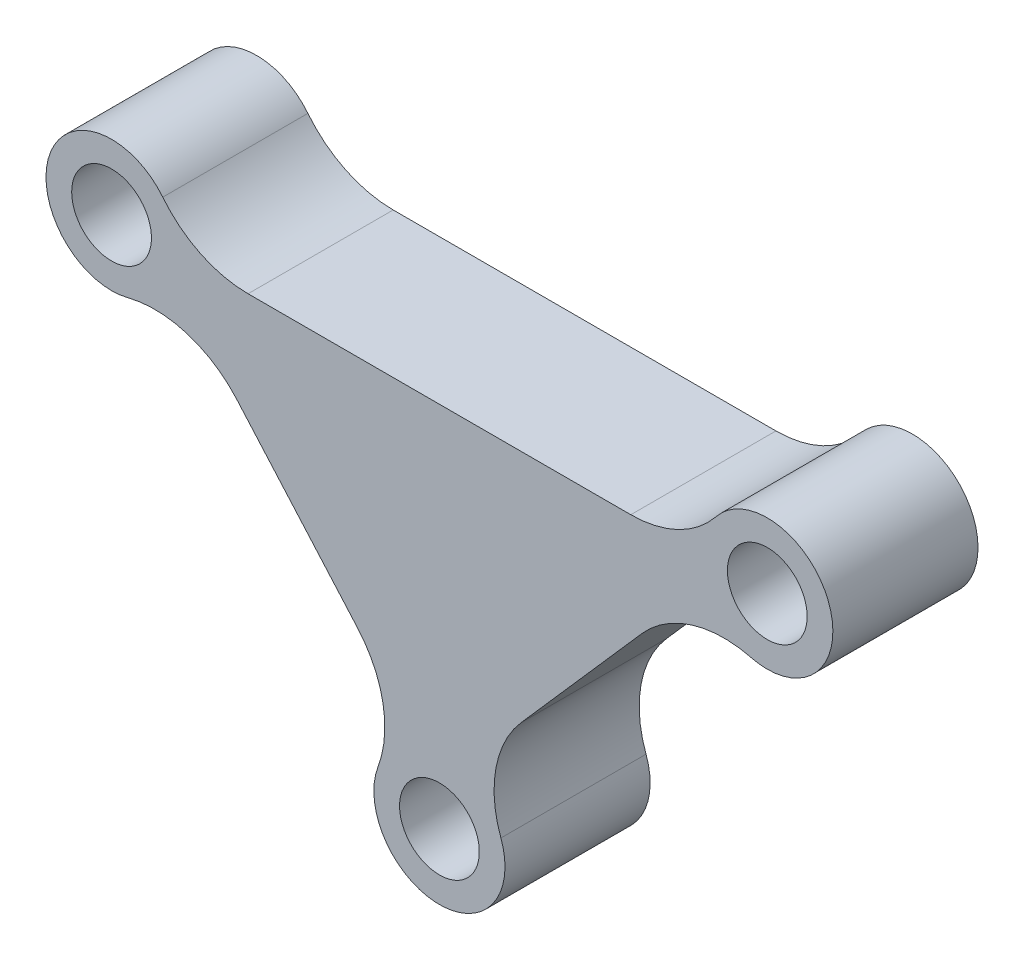
ISO-10303-21;
HEADER;
FILE_DESCRIPTION(('STEP AP214'),'2;1');
FILE_NAME('part.step','',(''),(''),'','','');
FILE_SCHEMA(('AUTOMOTIVE_DESIGN { 1 0 10303 214 1 1 1 1 }'));
ENDSEC;
DATA;
#1=APPLICATION_CONTEXT('core data for automotive mechanical design processes');
#2=APPLICATION_PROTOCOL_DEFINITION('international standard','automotive_design',2000,#1);
#3=PRODUCT_CONTEXT('',#1,'mechanical');
#4=PRODUCT('Part','Part','',(#3));
#5=PRODUCT_RELATED_PRODUCT_CATEGORY('part','',(#4));
#6=PRODUCT_DEFINITION_FORMATION('','',#4);
#7=PRODUCT_DEFINITION_CONTEXT('part definition',#1,'design');
#8=PRODUCT_DEFINITION('design','',#6,#7);
#9=PRODUCT_DEFINITION_SHAPE('','',#8);
#10=(LENGTH_UNIT() NAMED_UNIT(*) SI_UNIT(.MILLI.,.METRE.));
#11=(NAMED_UNIT(*) PLANE_ANGLE_UNIT() SI_UNIT($,.RADIAN.));
#12=(NAMED_UNIT(*) SI_UNIT($,.STERADIAN.) SOLID_ANGLE_UNIT());
#13=UNCERTAINTY_MEASURE_WITH_UNIT(LENGTH_MEASURE(1.E-05),#10,'distance_accuracy_value','');
#14=(GEOMETRIC_REPRESENTATION_CONTEXT(3) GLOBAL_UNCERTAINTY_ASSIGNED_CONTEXT((#13)) GLOBAL_UNIT_ASSIGNED_CONTEXT((#10,
#11,#12)) REPRESENTATION_CONTEXT('',''));
#15=CARTESIAN_POINT('',(0.,0.,0.));
#16=DIRECTION('',(0.,0.,1.));
#17=DIRECTION('',(1.,0.,0.));
#18=AXIS2_PLACEMENT_3D('',#15,#16,#17);
#19=CARTESIAN_POINT('',(0.,0.,6.64));
#20=DIRECTION('',(0.,0.,1.));
#21=DIRECTION('',(1.,0.,0.));
#22=AXIS2_PLACEMENT_3D('',#19,#20,#21);
#23=PLANE('',#22);
#24=CARTESIAN_POINT('',(-15.,10.,6.64));
#25=DIRECTION('',(0.,0.,1.));
#26=DIRECTION('',(1.,0.,0.));
#27=AXIS2_PLACEMENT_3D('',#24,#25,#26);
#28=CIRCLE('',#27,1.825);
#29=CARTESIAN_POINT('',(-16.825,10.,6.64));
#30=VERTEX_POINT('',#29);
#31=EDGE_CURVE('E429',#30,#30,#28,.T.);
#32=ORIENTED_EDGE('',*,*,#31,.F.);
#33=EDGE_LOOP('',(#32));
#34=FACE_BOUND('',#33,.T.);
#35=CARTESIAN_POINT('',(15.,10.,6.64));
#36=DIRECTION('',(0.,0.,1.));
#37=DIRECTION('',(1.,0.,0.));
#38=AXIS2_PLACEMENT_3D('',#35,#36,#37);
#39=CIRCLE('',#38,1.825);
#40=CARTESIAN_POINT('',(13.175,10.,6.64));
#41=VERTEX_POINT('',#40);
#42=EDGE_CURVE('E419',#41,#41,#39,.T.);
#43=ORIENTED_EDGE('',*,*,#42,.F.);
#44=EDGE_LOOP('',(#43));
#45=FACE_BOUND('',#44,.T.);
#46=CARTESIAN_POINT('',(0.,-6.825,6.64));
#47=DIRECTION('',(0.,0.,1.));
#48=DIRECTION('',(1.,0.,0.));
#49=AXIS2_PLACEMENT_3D('',#46,#47,#48);
#50=CIRCLE('',#49,1.825);
#51=CARTESIAN_POINT('',(-1.825,-6.825,6.64));
#52=VERTEX_POINT('',#51);
#53=EDGE_CURVE('E418',#52,#52,#50,.T.);
#54=ORIENTED_EDGE('',*,*,#53,.F.);
#55=EDGE_LOOP('',(#54));
#56=FACE_BOUND('',#55,.T.);
#57=DIRECTION('',(-0.659921886299402,0.751334215900647,0.));
#58=VECTOR('',#57,1.);
#59=CARTESIAN_POINT('',(-2.47910946499218,-2.1774844800848,6.64));
#60=LINE('',#59,#58);
#61=CARTESIAN_POINT('',(-3.74245116446397,-0.7391447842915,6.64));
#62=VERTEX_POINT('',#61);
#63=CARTESIAN_POINT('',(-9.26477937711987,5.54813591322946,6.64));
#64=VERTEX_POINT('',#63);
#65=EDGE_CURVE('E404',#62,#64,#60,.T.);
#66=ORIENTED_EDGE('',*,*,#65,.F.);
#67=CARTESIAN_POINT('',(-7.4991222439672,-4.03875421578851,6.64));
#68=DIRECTION('',(0.,0.,1.));
#69=DIRECTION('',(1.,0.,0.));
#70=AXIS2_PLACEMENT_3D('',#67,#68,#69);
#71=CIRCLE('',#70,5.);
#72=CARTESIAN_POINT('',(-2.8121708414877,-5.78015783092069,6.64));
#73=VERTEX_POINT('',#72);
#74=EDGE_CURVE('E372',#62,#73,#71,.F.);
#75=ORIENTED_EDGE('',*,*,#74,.T.);
#76=CARTESIAN_POINT('',(0.,-6.825,6.64));
#77=DIRECTION('',(0.,0.,1.));
#78=DIRECTION('',(1.,0.,0.));
#79=AXIS2_PLACEMENT_3D('',#76,#77,#78);
#80=CIRCLE('',#79,3.);
#81=CARTESIAN_POINT('',(2.8121708414877,-5.78015783092069,6.64));
#82=VERTEX_POINT('',#81);
#83=EDGE_CURVE('E401',#73,#82,#80,.T.);
#84=ORIENTED_EDGE('',*,*,#83,.T.);
#85=CARTESIAN_POINT('',(7.4991222439672,-4.03875421578851,6.64));
#86=DIRECTION('',(0.,0.,1.));
#87=DIRECTION('',(1.,0.,0.));
#88=AXIS2_PLACEMENT_3D('',#85,#86,#87);
#89=CIRCLE('',#88,5.);
#90=CARTESIAN_POINT('',(3.74245116446397,-0.739144784291498,6.64));
#91=VERTEX_POINT('',#90);
#92=EDGE_CURVE('E12',#82,#91,#89,.F.);
#93=ORIENTED_EDGE('',*,*,#92,.T.);
#94=DIRECTION('',(-0.659921886299402,-0.751334215900647,0.));
#95=VECTOR('',#94,1.);
#96=CARTESIAN_POINT('',(2.47910946499218,-2.1774844800848,6.64));
#97=LINE('',#96,#95);
#98=CARTESIAN_POINT('',(9.26477937711987,5.54813591322946,6.64));
#99=VERTEX_POINT('',#98);
#100=EDGE_CURVE('E399',#99,#91,#97,.T.);
#101=ORIENTED_EDGE('',*,*,#100,.F.);
#102=CARTESIAN_POINT('',(13.0214504566231,2.24852648173245,6.64));
#103=DIRECTION('',(0.,0.,1.));
#104=DIRECTION('',(1.,0.,0.));
#105=AXIS2_PLACEMENT_3D('',#102,#103,#104);
#106=CIRCLE('',#105,5.);
#107=CARTESIAN_POINT('',(14.2580439212337,7.09319743064967,6.64));
#108=VERTEX_POINT('',#107);
#109=EDGE_CURVE('E376',#99,#108,#106,.F.);
#110=ORIENTED_EDGE('',*,*,#109,.T.);
#111=CARTESIAN_POINT('',(15.,10.,6.64));
#112=DIRECTION('',(0.,0.,1.));
#113=DIRECTION('',(1.,0.,0.));
#114=AXIS2_PLACEMENT_3D('',#111,#112,#113);
#115=CIRCLE('',#114,3.);
#116=CARTESIAN_POINT('',(12.6581257506006,11.875,6.64));
#117=VERTEX_POINT('',#116);
#118=EDGE_CURVE('E411',#108,#117,#115,.T.);
#119=ORIENTED_EDGE('',*,*,#118,.T.);
#120=CARTESIAN_POINT('',(8.7550020016016,15.,6.64));
#121=DIRECTION('',(0.,0.,1.));
#122=DIRECTION('',(1.,0.,0.));
#123=AXIS2_PLACEMENT_3D('',#120,#121,#122);
#124=CIRCLE('',#123,5.);
#125=CARTESIAN_POINT('',(8.7550020016016,10.,6.64));
#126=VERTEX_POINT('',#125);
#127=EDGE_CURVE('E380',#117,#126,#124,.F.);
#128=ORIENTED_EDGE('',*,*,#127,.T.);
#129=DIRECTION('',(1.,0.,0.));
#130=VECTOR('',#129,1.);
#131=CARTESIAN_POINT('',(0.,10.,6.64));
#132=LINE('',#131,#130);
#133=CARTESIAN_POINT('',(-8.7550020016016,10.,6.64));
#134=VERTEX_POINT('',#133);
#135=EDGE_CURVE('E319',#134,#126,#132,.T.);
#136=ORIENTED_EDGE('',*,*,#135,.F.);
#137=CARTESIAN_POINT('',(-8.7550020016016,15.,6.64));
#138=DIRECTION('',(0.,0.,1.));
#139=DIRECTION('',(1.,0.,0.));
#140=AXIS2_PLACEMENT_3D('',#137,#138,#139);
#141=CIRCLE('',#140,5.);
#142=CARTESIAN_POINT('',(-12.6581257506006,11.875,6.64));
#143=VERTEX_POINT('',#142);
#144=EDGE_CURVE('E313',#134,#143,#141,.F.);
#145=ORIENTED_EDGE('',*,*,#144,.T.);
#146=CARTESIAN_POINT('',(-15.,10.,6.64));
#147=DIRECTION('',(0.,0.,1.));
#148=DIRECTION('',(1.,0.,0.));
#149=AXIS2_PLACEMENT_3D('',#146,#147,#148);
#150=CIRCLE('',#149,3.);
#151=CARTESIAN_POINT('',(-14.2580439212337,7.09319743064967,6.64));
#152=VERTEX_POINT('',#151);
#153=EDGE_CURVE('E316',#143,#152,#150,.T.);
#154=ORIENTED_EDGE('',*,*,#153,.T.);
#155=CARTESIAN_POINT('',(-13.0214504566231,2.24852648173245,6.64));
#156=DIRECTION('',(0.,0.,1.));
#157=DIRECTION('',(1.,0.,0.));
#158=AXIS2_PLACEMENT_3D('',#155,#156,#157);
#159=CIRCLE('',#158,5.);
#160=EDGE_CURVE('E368',#152,#64,#159,.F.);
#161=ORIENTED_EDGE('',*,*,#160,.T.);
#162=EDGE_LOOP('',(#66,#75,#84,#93,#101,#110,#119,#128,#136,#145,#154,#161));
#163=FACE_BOUND('',#162,.T.);
#164=ADVANCED_FACE('F224',(#34,#45,#56,#163),#23,.T.);
#165=CARTESIAN_POINT('',(0.,0.,0.));
#166=DIRECTION('',(0.,0.,1.));
#167=DIRECTION('',(1.,0.,0.));
#168=AXIS2_PLACEMENT_3D('',#165,#166,#167);
#169=PLANE('',#168);
#170=CARTESIAN_POINT('',(-15.,10.,0.));
#171=DIRECTION('',(0.,0.,1.));
#172=DIRECTION('',(1.,0.,0.));
#173=AXIS2_PLACEMENT_3D('',#170,#171,#172);
#174=CIRCLE('',#173,1.825);
#175=CARTESIAN_POINT('',(-16.825,10.,0.));
#176=VERTEX_POINT('',#175);
#177=EDGE_CURVE('E432',#176,#176,#174,.T.);
#178=ORIENTED_EDGE('',*,*,#177,.T.);
#179=EDGE_LOOP('',(#178));
#180=FACE_BOUND('',#179,.T.);
#181=CARTESIAN_POINT('',(15.,10.,0.));
#182=DIRECTION('',(0.,0.,1.));
#183=DIRECTION('',(1.,0.,0.));
#184=AXIS2_PLACEMENT_3D('',#181,#182,#183);
#185=CIRCLE('',#184,1.825);
#186=CARTESIAN_POINT('',(13.175,10.,0.));
#187=VERTEX_POINT('',#186);
#188=EDGE_CURVE('E334',#187,#187,#185,.T.);
#189=ORIENTED_EDGE('',*,*,#188,.T.);
#190=EDGE_LOOP('',(#189));
#191=FACE_BOUND('',#190,.T.);
#192=CARTESIAN_POINT('',(0.,-6.825,0.));
#193=DIRECTION('',(0.,0.,1.));
#194=DIRECTION('',(1.,0.,0.));
#195=AXIS2_PLACEMENT_3D('',#192,#193,#194);
#196=CIRCLE('',#195,1.825);
#197=CARTESIAN_POINT('',(-1.825,-6.825,0.));
#198=VERTEX_POINT('',#197);
#199=EDGE_CURVE('E408',#198,#198,#196,.T.);
#200=ORIENTED_EDGE('',*,*,#199,.T.);
#201=EDGE_LOOP('',(#200));
#202=FACE_BOUND('',#201,.T.);
#203=CARTESIAN_POINT('',(15.,10.,0.));
#204=DIRECTION('',(0.,0.,1.));
#205=DIRECTION('',(1.,0.,0.));
#206=AXIS2_PLACEMENT_3D('',#203,#204,#205);
#207=CIRCLE('',#206,3.);
#208=CARTESIAN_POINT('',(14.2580439212337,7.09319743064967,0.));
#209=VERTEX_POINT('',#208);
#210=CARTESIAN_POINT('',(12.6581257506006,11.875,0.));
#211=VERTEX_POINT('',#210);
#212=EDGE_CURVE('E422',#209,#211,#207,.T.);
#213=ORIENTED_EDGE('',*,*,#212,.F.);
#214=CARTESIAN_POINT('',(13.0214504566231,2.24852648173245,0.));
#215=DIRECTION('',(0.,0.,1.));
#216=DIRECTION('',(1.,0.,0.));
#217=AXIS2_PLACEMENT_3D('',#214,#215,#216);
#218=CIRCLE('',#217,5.);
#219=CARTESIAN_POINT('',(9.26477937711987,5.54813591322946,0.));
#220=VERTEX_POINT('',#219);
#221=EDGE_CURVE('E374',#209,#220,#218,.T.);
#222=ORIENTED_EDGE('',*,*,#221,.T.);
#223=DIRECTION('',(-0.659921886299402,-0.751334215900647,0.));
#224=VECTOR('',#223,1.);
#225=CARTESIAN_POINT('',(2.47910946499218,-2.1774844800848,0.));
#226=LINE('',#225,#224);
#227=CARTESIAN_POINT('',(3.74245116446397,-0.739144784291498,0.));
#228=VERTEX_POINT('',#227);
#229=EDGE_CURVE('E388',#220,#228,#226,.T.);
#230=ORIENTED_EDGE('',*,*,#229,.T.);
#231=CARTESIAN_POINT('',(7.4991222439672,-4.03875421578851,0.));
#232=DIRECTION('',(0.,0.,1.));
#233=DIRECTION('',(1.,0.,0.));
#234=AXIS2_PLACEMENT_3D('',#231,#232,#233);
#235=CIRCLE('',#234,5.);
#236=CARTESIAN_POINT('',(2.8121708414877,-5.78015783092069,0.));
#237=VERTEX_POINT('',#236);
#238=EDGE_CURVE('E232',#228,#237,#235,.T.);
#239=ORIENTED_EDGE('',*,*,#238,.T.);
#240=CARTESIAN_POINT('',(0.,-6.825,0.));
#241=DIRECTION('',(0.,0.,1.));
#242=DIRECTION('',(1.,0.,0.));
#243=AXIS2_PLACEMENT_3D('',#240,#241,#242);
#244=CIRCLE('',#243,3.);
#245=CARTESIAN_POINT('',(-2.8121708414877,-5.78015783092069,0.));
#246=VERTEX_POINT('',#245);
#247=EDGE_CURVE('E387',#246,#237,#244,.T.);
#248=ORIENTED_EDGE('',*,*,#247,.F.);
#249=CARTESIAN_POINT('',(-7.4991222439672,-4.03875421578851,0.));
#250=DIRECTION('',(0.,0.,1.));
#251=DIRECTION('',(1.,0.,0.));
#252=AXIS2_PLACEMENT_3D('',#249,#250,#251);
#253=CIRCLE('',#252,5.);
#254=CARTESIAN_POINT('',(-3.74245116446397,-0.7391447842915,0.));
#255=VERTEX_POINT('',#254);
#256=EDGE_CURVE('E370',#246,#255,#253,.T.);
#257=ORIENTED_EDGE('',*,*,#256,.T.);
#258=DIRECTION('',(-0.659921886299402,0.751334215900647,0.));
#259=VECTOR('',#258,1.);
#260=CARTESIAN_POINT('',(-2.47910946499218,-2.1774844800848,0.));
#261=LINE('',#260,#259);
#262=CARTESIAN_POINT('',(-9.26477937711987,5.54813591322946,0.));
#263=VERTEX_POINT('',#262);
#264=EDGE_CURVE('E396',#255,#263,#261,.T.);
#265=ORIENTED_EDGE('',*,*,#264,.T.);
#266=CARTESIAN_POINT('',(-13.0214504566231,2.24852648173245,0.));
#267=DIRECTION('',(0.,0.,1.));
#268=DIRECTION('',(1.,0.,0.));
#269=AXIS2_PLACEMENT_3D('',#266,#267,#268);
#270=CIRCLE('',#269,5.);
#271=CARTESIAN_POINT('',(-14.2580439212337,7.09319743064967,0.));
#272=VERTEX_POINT('',#271);
#273=EDGE_CURVE('E323',#263,#272,#270,.T.);
#274=ORIENTED_EDGE('',*,*,#273,.T.);
#275=CARTESIAN_POINT('',(-15.,10.,0.));
#276=DIRECTION('',(0.,0.,1.));
#277=DIRECTION('',(1.,0.,0.));
#278=AXIS2_PLACEMENT_3D('',#275,#276,#277);
#279=CIRCLE('',#278,3.);
#280=CARTESIAN_POINT('',(-12.6581257506006,11.875,0.));
#281=VERTEX_POINT('',#280);
#282=EDGE_CURVE('E335',#281,#272,#279,.T.);
#283=ORIENTED_EDGE('',*,*,#282,.F.);
#284=CARTESIAN_POINT('',(-8.7550020016016,15.,0.));
#285=DIRECTION('',(0.,0.,1.));
#286=DIRECTION('',(1.,0.,0.));
#287=AXIS2_PLACEMENT_3D('',#284,#285,#286);
#288=CIRCLE('',#287,5.);
#289=CARTESIAN_POINT('',(-8.7550020016016,10.,0.));
#290=VERTEX_POINT('',#289);
#291=EDGE_CURVE('E324',#281,#290,#288,.T.);
#292=ORIENTED_EDGE('',*,*,#291,.T.);
#293=DIRECTION('',(1.,0.,0.));
#294=VECTOR('',#293,1.);
#295=CARTESIAN_POINT('',(0.,10.,0.));
#296=LINE('',#295,#294);
#297=CARTESIAN_POINT('',(8.7550020016016,10.,0.));
#298=VERTEX_POINT('',#297);
#299=EDGE_CURVE('E415',#290,#298,#296,.T.);
#300=ORIENTED_EDGE('',*,*,#299,.T.);
#301=CARTESIAN_POINT('',(8.7550020016016,15.,0.));
#302=DIRECTION('',(0.,0.,1.));
#303=DIRECTION('',(1.,0.,0.));
#304=AXIS2_PLACEMENT_3D('',#301,#302,#303);
#305=CIRCLE('',#304,5.);
#306=EDGE_CURVE('E378',#298,#211,#305,.T.);
#307=ORIENTED_EDGE('',*,*,#306,.T.);
#308=EDGE_LOOP('',(#213,#222,#230,#239,#248,#257,#265,#274,#283,#292,#300,#307));
#309=FACE_BOUND('',#308,.T.);
#310=ADVANCED_FACE('F386',(#180,#191,#202,#309),#169,.F.);
#311=CARTESIAN_POINT('',(0.,-6.825,6.64));
#312=DIRECTION('',(0.,0.,-1.));
#313=DIRECTION('',(-1.,0.,0.));
#314=AXIS2_PLACEMENT_3D('',#311,#312,#313);
#315=CYLINDRICAL_SURFACE('',#314,1.825);
#316=CARTESIAN_POINT('',(-1.825,-6.825,0.));
#317=CARTESIAN_POINT('',(-1.825,-6.825,0.0691666666666659));
#318=CARTESIAN_POINT('',(-1.825,-6.825,0.138333333333333));
#319=CARTESIAN_POINT('',(-1.825,-6.825,0.276666666666666));
#320=CARTESIAN_POINT('',(-1.825,-6.825,0.345833333333333));
#321=CARTESIAN_POINT('',(-1.825,-6.825,0.484166666666666));
#322=CARTESIAN_POINT('',(-1.825,-6.825,0.553333333333332));
#323=CARTESIAN_POINT('',(-1.825,-6.825,0.691666666666666));
#324=CARTESIAN_POINT('',(-1.825,-6.825,0.760833333333332));
#325=CARTESIAN_POINT('',(-1.825,-6.825,0.899166666666666));
#326=CARTESIAN_POINT('',(-1.825,-6.825,0.968333333333333));
#327=CARTESIAN_POINT('',(-1.825,-6.825,1.10666666666667));
#328=CARTESIAN_POINT('',(-1.825,-6.825,1.17583333333333));
#329=CARTESIAN_POINT('',(-1.825,-6.825,1.31416666666667));
#330=CARTESIAN_POINT('',(-1.825,-6.825,1.38333333333333));
#331=CARTESIAN_POINT('',(-1.825,-6.825,1.52166666666667));
#332=CARTESIAN_POINT('',(-1.825,-6.825,1.59083333333333));
#333=CARTESIAN_POINT('',(-1.825,-6.825,1.72916666666667));
#334=CARTESIAN_POINT('',(-1.825,-6.825,1.79833333333333));
#335=CARTESIAN_POINT('',(-1.825,-6.825,1.93666666666667));
#336=CARTESIAN_POINT('',(-1.825,-6.825,2.00583333333333));
#337=CARTESIAN_POINT('',(-1.825,-6.825,2.14416666666667));
#338=CARTESIAN_POINT('',(-1.825,-6.825,2.21333333333333));
#339=CARTESIAN_POINT('',(-1.825,-6.825,2.35166666666667));
#340=CARTESIAN_POINT('',(-1.825,-6.825,2.42083333333333));
#341=CARTESIAN_POINT('',(-1.825,-6.825,2.55916666666667));
#342=CARTESIAN_POINT('',(-1.825,-6.825,2.62833333333333));
#343=CARTESIAN_POINT('',(-1.825,-6.825,2.76666666666667));
#344=CARTESIAN_POINT('',(-1.825,-6.825,2.83583333333333));
#345=CARTESIAN_POINT('',(-1.825,-6.825,2.97416666666667));
#346=CARTESIAN_POINT('',(-1.825,-6.825,3.04333333333333));
#347=CARTESIAN_POINT('',(-1.825,-6.825,3.18166666666667));
#348=CARTESIAN_POINT('',(-1.825,-6.825,3.25083333333333));
#349=CARTESIAN_POINT('',(-1.825,-6.825,3.38916666666667));
#350=CARTESIAN_POINT('',(-1.825,-6.825,3.45833333333333));
#351=CARTESIAN_POINT('',(-1.825,-6.825,3.59666666666667));
#352=CARTESIAN_POINT('',(-1.825,-6.825,3.66583333333333));
#353=CARTESIAN_POINT('',(-1.825,-6.825,3.80416666666667));
#354=CARTESIAN_POINT('',(-1.825,-6.825,3.87333333333333));
#355=CARTESIAN_POINT('',(-1.825,-6.825,4.01166666666667));
#356=CARTESIAN_POINT('',(-1.825,-6.825,4.08083333333333));
#357=CARTESIAN_POINT('',(-1.825,-6.825,4.21916666666667));
#358=CARTESIAN_POINT('',(-1.825,-6.825,4.28833333333333));
#359=CARTESIAN_POINT('',(-1.825,-6.825,4.42666666666667));
#360=CARTESIAN_POINT('',(-1.825,-6.825,4.49583333333333));
#361=CARTESIAN_POINT('',(-1.825,-6.825,4.63416666666667));
#362=CARTESIAN_POINT('',(-1.825,-6.825,4.70333333333333));
#363=CARTESIAN_POINT('',(-1.825,-6.825,4.84166666666667));
#364=CARTESIAN_POINT('',(-1.825,-6.825,4.91083333333333));
#365=CARTESIAN_POINT('',(-1.825,-6.825,5.04916666666667));
#366=CARTESIAN_POINT('',(-1.825,-6.825,5.11833333333333));
#367=CARTESIAN_POINT('',(-1.825,-6.825,5.25666666666667));
#368=CARTESIAN_POINT('',(-1.825,-6.825,5.32583333333333));
#369=CARTESIAN_POINT('',(-1.825,-6.825,5.46416666666667));
#370=CARTESIAN_POINT('',(-1.825,-6.825,5.53333333333333));
#371=CARTESIAN_POINT('',(-1.825,-6.825,5.67166666666667));
#372=CARTESIAN_POINT('',(-1.825,-6.825,5.74083333333333));
#373=CARTESIAN_POINT('',(-1.825,-6.825,5.87916666666667));
#374=CARTESIAN_POINT('',(-1.825,-6.825,5.94833333333333));
#375=CARTESIAN_POINT('',(-1.825,-6.825,6.08666666666667));
#376=CARTESIAN_POINT('',(-1.825,-6.825,6.15583333333333));
#377=CARTESIAN_POINT('',(-1.825,-6.825,6.29416666666667));
#378=CARTESIAN_POINT('',(-1.825,-6.825,6.36333333333333));
#379=CARTESIAN_POINT('',(-1.825,-6.825,6.50166666666667));
#380=CARTESIAN_POINT('',(-1.825,-6.825,6.57083333333333));
#381=CARTESIAN_POINT('',(-1.825,-6.825,6.64));
#382=B_SPLINE_CURVE_WITH_KNOTS('',3,(#316,#317,#318,#319,#320,#321,#322,#323,#324,#325,#326,
#327,#328,#329,#330,#331,#332,#333,#334,#335,#336,#337,#338,#339,#340,#341,#342,#343,#344,#345,
#346,#347,#348,#349,#350,#351,#352,#353,#354,#355,#356,#357,#358,#359,#360,#361,#362,#363,#364,
#365,#366,#367,#368,#369,#370,#371,#372,#373,#374,#375,#376,#377,#378,#379,#380,#381),
.UNSPECIFIED.,.F.,.F.,(4,2,2,2,2,2,2,2,2,2,2,2,2,2,2,2,2,2,2,2,2,2,2,2,2,2,2,2,2,2,2,2,4),(0.,
0.2075,0.415,0.6225,0.83,1.0375,1.245,1.4525,1.66,1.8675,2.075,2.2825,2.49,2.6975,2.905,3.1125,
3.32,3.5275,3.735,3.9425,4.15,4.3575,4.565,4.7725,4.98,5.1875,5.395,5.6025,5.81,6.0175,6.225,
6.4325,6.64),.UNSPECIFIED.);
#383=EDGE_CURVE('BSEAM447',#198,#52,#382,.T.);
#384=ORIENTED_EDGE('',*,*,#199,.F.);
#385=ORIENTED_EDGE('',*,*,#53,.T.);
#386=ORIENTED_EDGE('',*,*,#383,.T.);
#387=ORIENTED_EDGE('',*,*,#383,.F.);
#388=EDGE_LOOP('',(#384,#386,#385,#387));
#389=FACE_BOUND('',#388,.T.);
#390=ADVANCED_FACE('F447',(#389),#315,.F.);
#391=CARTESIAN_POINT('',(0.,-6.825,6.64));
#392=DIRECTION('',(0.,0.,-1.));
#393=DIRECTION('',(-1.,0.,0.));
#394=AXIS2_PLACEMENT_3D('',#391,#392,#393);
#395=CYLINDRICAL_SURFACE('',#394,3.);
#396=ORIENTED_EDGE('',*,*,#83,.F.);
#397=DIRECTION('',(0.,0.,-1.));
#398=VECTOR('',#397,1.);
#399=CARTESIAN_POINT('',(-2.8121708414877,-5.78015783092069,6.64));
#400=LINE('',#399,#398);
#401=EDGE_CURVE('E354',#73,#246,#400,.T.);
#402=ORIENTED_EDGE('',*,*,#401,.T.);
#403=ORIENTED_EDGE('',*,*,#247,.T.);
#404=DIRECTION('',(0.,0.,-1.));
#405=VECTOR('',#404,1.);
#406=CARTESIAN_POINT('',(2.8121708414877,-5.78015783092069,6.64));
#407=LINE('',#406,#405);
#408=EDGE_CURVE('E352',#237,#82,#407,.F.);
#409=ORIENTED_EDGE('',*,*,#408,.T.);
#410=EDGE_LOOP('',(#396,#402,#403,#409));
#411=FACE_BOUND('',#410,.T.);
#412=ADVANCED_FACE('F394',(#411),#395,.T.);
#413=CARTESIAN_POINT('',(2.47910946499218,-2.1774844800848,6.64));
#414=DIRECTION('',(0.751334215900647,-0.659921886299401,0.));
#415=DIRECTION('',(0.659921886299401,0.751334215900647,0.));
#416=AXIS2_PLACEMENT_3D('',#413,#414,#415);
#417=PLANE('',#416);
#418=ORIENTED_EDGE('',*,*,#229,.F.);
#419=DIRECTION('',(0.,0.,-1.));
#420=VECTOR('',#419,1.);
#421=CARTESIAN_POINT('',(9.26477937711987,5.54813591322946,6.64));
#422=LINE('',#421,#420);
#423=EDGE_CURVE('E244',#220,#99,#422,.F.);
#424=ORIENTED_EDGE('',*,*,#423,.T.);
#425=ORIENTED_EDGE('',*,*,#100,.T.);
#426=DIRECTION('',(0.,0.,-1.));
#427=VECTOR('',#426,1.);
#428=CARTESIAN_POINT('',(3.74245116446397,-0.739144784291498,6.64));
#429=LINE('',#428,#427);
#430=EDGE_CURVE('E362',#91,#228,#429,.T.);
#431=ORIENTED_EDGE('',*,*,#430,.T.);
#432=EDGE_LOOP('',(#418,#424,#425,#431));
#433=FACE_BOUND('',#432,.T.);
#434=ADVANCED_FACE('F398',(#433),#417,.T.);
#435=CARTESIAN_POINT('',(0.,10.,6.64));
#436=DIRECTION('',(0.,1.,0.));
#437=DIRECTION('',(0.,0.,1.));
#438=AXIS2_PLACEMENT_3D('',#435,#436,#437);
#439=PLANE('',#438);
#440=ORIENTED_EDGE('',*,*,#299,.F.);
#441=DIRECTION('',(0.,0.,-1.));
#442=VECTOR('',#441,1.);
#443=CARTESIAN_POINT('',(-8.7550020016016,10.,6.64));
#444=LINE('',#443,#442);
#445=EDGE_CURVE('E341',#290,#134,#444,.F.);
#446=ORIENTED_EDGE('',*,*,#445,.T.);
#447=ORIENTED_EDGE('',*,*,#135,.T.);
#448=DIRECTION('',(0.,0.,-1.));
#449=VECTOR('',#448,1.);
#450=CARTESIAN_POINT('',(8.7550020016016,10.,6.64));
#451=LINE('',#450,#449);
#452=EDGE_CURVE('E338',#126,#298,#451,.T.);
#453=ORIENTED_EDGE('',*,*,#452,.T.);
#454=EDGE_LOOP('',(#440,#446,#447,#453));
#455=FACE_BOUND('',#454,.T.);
#456=ADVANCED_FACE('F463',(#455),#439,.T.);
#457=CARTESIAN_POINT('',(-2.47910946499218,-2.1774844800848,6.64));
#458=DIRECTION('',(-0.751334215900647,-0.659921886299401,0.));
#459=DIRECTION('',(0.659921886299401,-0.751334215900647,0.));
#460=AXIS2_PLACEMENT_3D('',#457,#458,#459);
#461=PLANE('',#460);
#462=ORIENTED_EDGE('',*,*,#65,.T.);
#463=DIRECTION('',(0.,0.,-1.));
#464=VECTOR('',#463,1.);
#465=CARTESIAN_POINT('',(-9.26477937711987,5.54813591322946,6.64));
#466=LINE('',#465,#464);
#467=EDGE_CURVE('E349',#64,#263,#466,.T.);
#468=ORIENTED_EDGE('',*,*,#467,.T.);
#469=ORIENTED_EDGE('',*,*,#264,.F.);
#470=DIRECTION('',(0.,0.,-1.));
#471=VECTOR('',#470,1.);
#472=CARTESIAN_POINT('',(-3.74245116446397,-0.7391447842915,6.64));
#473=LINE('',#472,#471);
#474=EDGE_CURVE('E347',#255,#62,#473,.F.);
#475=ORIENTED_EDGE('',*,*,#474,.T.);
#476=EDGE_LOOP('',(#462,#468,#469,#475));
#477=FACE_BOUND('',#476,.T.);
#478=ADVANCED_FACE('F440',(#477),#461,.T.);
#479=CARTESIAN_POINT('',(15.,10.,6.64));
#480=DIRECTION('',(0.,0.,-1.));
#481=DIRECTION('',(-1.,0.,0.));
#482=AXIS2_PLACEMENT_3D('',#479,#480,#481);
#483=CYLINDRICAL_SURFACE('',#482,1.825);
#484=CARTESIAN_POINT('',(13.175,10.,0.));
#485=CARTESIAN_POINT('',(13.175,10.,0.0691666666666659));
#486=CARTESIAN_POINT('',(13.175,10.,0.138333333333333));
#487=CARTESIAN_POINT('',(13.175,10.,0.276666666666666));
#488=CARTESIAN_POINT('',(13.175,10.,0.345833333333333));
#489=CARTESIAN_POINT('',(13.175,10.,0.484166666666666));
#490=CARTESIAN_POINT('',(13.175,10.,0.553333333333332));
#491=CARTESIAN_POINT('',(13.175,10.,0.691666666666666));
#492=CARTESIAN_POINT('',(13.175,10.,0.760833333333332));
#493=CARTESIAN_POINT('',(13.175,10.,0.899166666666666));
#494=CARTESIAN_POINT('',(13.175,10.,0.968333333333333));
#495=CARTESIAN_POINT('',(13.175,10.,1.10666666666667));
#496=CARTESIAN_POINT('',(13.175,10.,1.17583333333333));
#497=CARTESIAN_POINT('',(13.175,10.,1.31416666666667));
#498=CARTESIAN_POINT('',(13.175,10.,1.38333333333333));
#499=CARTESIAN_POINT('',(13.175,10.,1.52166666666667));
#500=CARTESIAN_POINT('',(13.175,10.,1.59083333333333));
#501=CARTESIAN_POINT('',(13.175,10.,1.72916666666667));
#502=CARTESIAN_POINT('',(13.175,10.,1.79833333333333));
#503=CARTESIAN_POINT('',(13.175,10.,1.93666666666667));
#504=CARTESIAN_POINT('',(13.175,10.,2.00583333333333));
#505=CARTESIAN_POINT('',(13.175,10.,2.14416666666667));
#506=CARTESIAN_POINT('',(13.175,10.,2.21333333333333));
#507=CARTESIAN_POINT('',(13.175,10.,2.35166666666667));
#508=CARTESIAN_POINT('',(13.175,10.,2.42083333333333));
#509=CARTESIAN_POINT('',(13.175,10.,2.55916666666667));
#510=CARTESIAN_POINT('',(13.175,10.,2.62833333333333));
#511=CARTESIAN_POINT('',(13.175,10.,2.76666666666667));
#512=CARTESIAN_POINT('',(13.175,10.,2.83583333333333));
#513=CARTESIAN_POINT('',(13.175,10.,2.97416666666667));
#514=CARTESIAN_POINT('',(13.175,10.,3.04333333333333));
#515=CARTESIAN_POINT('',(13.175,10.,3.18166666666667));
#516=CARTESIAN_POINT('',(13.175,10.,3.25083333333333));
#517=CARTESIAN_POINT('',(13.175,10.,3.38916666666667));
#518=CARTESIAN_POINT('',(13.175,10.,3.45833333333333));
#519=CARTESIAN_POINT('',(13.175,10.,3.59666666666667));
#520=CARTESIAN_POINT('',(13.175,10.,3.66583333333333));
#521=CARTESIAN_POINT('',(13.175,10.,3.80416666666667));
#522=CARTESIAN_POINT('',(13.175,10.,3.87333333333333));
#523=CARTESIAN_POINT('',(13.175,10.,4.01166666666667));
#524=CARTESIAN_POINT('',(13.175,10.,4.08083333333333));
#525=CARTESIAN_POINT('',(13.175,10.,4.21916666666667));
#526=CARTESIAN_POINT('',(13.175,10.,4.28833333333333));
#527=CARTESIAN_POINT('',(13.175,10.,4.42666666666667));
#528=CARTESIAN_POINT('',(13.175,10.,4.49583333333333));
#529=CARTESIAN_POINT('',(13.175,10.,4.63416666666667));
#530=CARTESIAN_POINT('',(13.175,10.,4.70333333333333));
#531=CARTESIAN_POINT('',(13.175,10.,4.84166666666667));
#532=CARTESIAN_POINT('',(13.175,10.,4.91083333333333));
#533=CARTESIAN_POINT('',(13.175,10.,5.04916666666667));
#534=CARTESIAN_POINT('',(13.175,10.,5.11833333333333));
#535=CARTESIAN_POINT('',(13.175,10.,5.25666666666667));
#536=CARTESIAN_POINT('',(13.175,10.,5.32583333333333));
#537=CARTESIAN_POINT('',(13.175,10.,5.46416666666667));
#538=CARTESIAN_POINT('',(13.175,10.,5.53333333333333));
#539=CARTESIAN_POINT('',(13.175,10.,5.67166666666667));
#540=CARTESIAN_POINT('',(13.175,10.,5.74083333333333));
#541=CARTESIAN_POINT('',(13.175,10.,5.87916666666667));
#542=CARTESIAN_POINT('',(13.175,10.,5.94833333333333));
#543=CARTESIAN_POINT('',(13.175,10.,6.08666666666667));
#544=CARTESIAN_POINT('',(13.175,10.,6.15583333333333));
#545=CARTESIAN_POINT('',(13.175,10.,6.29416666666667));
#546=CARTESIAN_POINT('',(13.175,10.,6.36333333333333));
#547=CARTESIAN_POINT('',(13.175,10.,6.50166666666667));
#548=CARTESIAN_POINT('',(13.175,10.,6.57083333333333));
#549=CARTESIAN_POINT('',(13.175,10.,6.64));
#550=B_SPLINE_CURVE_WITH_KNOTS('',3,(#484,#485,#486,#487,#488,#489,#490,#491,#492,#493,#494,
#495,#496,#497,#498,#499,#500,#501,#502,#503,#504,#505,#506,#507,#508,#509,#510,#511,#512,#513,
#514,#515,#516,#517,#518,#519,#520,#521,#522,#523,#524,#525,#526,#527,#528,#529,#530,#531,#532,
#533,#534,#535,#536,#537,#538,#539,#540,#541,#542,#543,#544,#545,#546,#547,#548,#549),
.UNSPECIFIED.,.F.,.F.,(4,2,2,2,2,2,2,2,2,2,2,2,2,2,2,2,2,2,2,2,2,2,2,2,2,2,2,2,2,2,2,2,4),(0.,
0.2075,0.415,0.6225,0.83,1.0375,1.245,1.4525,1.66,1.8675,2.075,2.2825,2.49,2.6975,2.905,3.1125,
3.32,3.5275,3.735,3.9425,4.15,4.3575,4.565,4.7725,4.98,5.1875,5.395,5.6025,5.81,6.0175,6.225,
6.4325,6.64),.UNSPECIFIED.);
#551=EDGE_CURVE('BSEAM462',#187,#41,#550,.T.);
#552=ORIENTED_EDGE('',*,*,#188,.F.);
#553=ORIENTED_EDGE('',*,*,#42,.T.);
#554=ORIENTED_EDGE('',*,*,#551,.T.);
#555=ORIENTED_EDGE('',*,*,#551,.F.);
#556=EDGE_LOOP('',(#552,#554,#553,#555));
#557=FACE_BOUND('',#556,.T.);
#558=ADVANCED_FACE('F462',(#557),#483,.F.);
#559=CARTESIAN_POINT('',(15.,10.,6.64));
#560=DIRECTION('',(0.,0.,-1.));
#561=DIRECTION('',(-1.,0.,0.));
#562=AXIS2_PLACEMENT_3D('',#559,#560,#561);
#563=CYLINDRICAL_SURFACE('',#562,3.);
#564=ORIENTED_EDGE('',*,*,#118,.F.);
#565=DIRECTION('',(0.,0.,-1.));
#566=VECTOR('',#565,1.);
#567=CARTESIAN_POINT('',(14.2580439212337,7.09319743064967,6.64));
#568=LINE('',#567,#566);
#569=EDGE_CURVE('E359',#108,#209,#568,.T.);
#570=ORIENTED_EDGE('',*,*,#569,.T.);
#571=ORIENTED_EDGE('',*,*,#212,.T.);
#572=DIRECTION('',(0.,0.,-1.));
#573=VECTOR('',#572,1.);
#574=CARTESIAN_POINT('',(12.6581257506006,11.875,6.64));
#575=LINE('',#574,#573);
#576=EDGE_CURVE('E357',#211,#117,#575,.F.);
#577=ORIENTED_EDGE('',*,*,#576,.T.);
#578=EDGE_LOOP('',(#564,#570,#571,#577));
#579=FACE_BOUND('',#578,.T.);
#580=ADVANCED_FACE('F469',(#579),#563,.T.);
#581=CARTESIAN_POINT('',(-15.,10.,6.64));
#582=DIRECTION('',(0.,0.,-1.));
#583=DIRECTION('',(-1.,0.,0.));
#584=AXIS2_PLACEMENT_3D('',#581,#582,#583);
#585=CYLINDRICAL_SURFACE('',#584,1.825);
#586=CARTESIAN_POINT('',(-16.825,10.,0.));
#587=CARTESIAN_POINT('',(-16.825,10.,0.0691666666666659));
#588=CARTESIAN_POINT('',(-16.825,10.,0.138333333333333));
#589=CARTESIAN_POINT('',(-16.825,10.,0.276666666666666));
#590=CARTESIAN_POINT('',(-16.825,10.,0.345833333333333));
#591=CARTESIAN_POINT('',(-16.825,10.,0.484166666666666));
#592=CARTESIAN_POINT('',(-16.825,10.,0.553333333333332));
#593=CARTESIAN_POINT('',(-16.825,10.,0.691666666666666));
#594=CARTESIAN_POINT('',(-16.825,10.,0.760833333333332));
#595=CARTESIAN_POINT('',(-16.825,10.,0.899166666666666));
#596=CARTESIAN_POINT('',(-16.825,10.,0.968333333333333));
#597=CARTESIAN_POINT('',(-16.825,10.,1.10666666666667));
#598=CARTESIAN_POINT('',(-16.825,10.,1.17583333333333));
#599=CARTESIAN_POINT('',(-16.825,10.,1.31416666666667));
#600=CARTESIAN_POINT('',(-16.825,10.,1.38333333333333));
#601=CARTESIAN_POINT('',(-16.825,10.,1.52166666666667));
#602=CARTESIAN_POINT('',(-16.825,10.,1.59083333333333));
#603=CARTESIAN_POINT('',(-16.825,10.,1.72916666666667));
#604=CARTESIAN_POINT('',(-16.825,10.,1.79833333333333));
#605=CARTESIAN_POINT('',(-16.825,10.,1.93666666666667));
#606=CARTESIAN_POINT('',(-16.825,10.,2.00583333333333));
#607=CARTESIAN_POINT('',(-16.825,10.,2.14416666666667));
#608=CARTESIAN_POINT('',(-16.825,10.,2.21333333333333));
#609=CARTESIAN_POINT('',(-16.825,10.,2.35166666666667));
#610=CARTESIAN_POINT('',(-16.825,10.,2.42083333333333));
#611=CARTESIAN_POINT('',(-16.825,10.,2.55916666666667));
#612=CARTESIAN_POINT('',(-16.825,10.,2.62833333333333));
#613=CARTESIAN_POINT('',(-16.825,10.,2.76666666666667));
#614=CARTESIAN_POINT('',(-16.825,10.,2.83583333333333));
#615=CARTESIAN_POINT('',(-16.825,10.,2.97416666666667));
#616=CARTESIAN_POINT('',(-16.825,10.,3.04333333333333));
#617=CARTESIAN_POINT('',(-16.825,10.,3.18166666666667));
#618=CARTESIAN_POINT('',(-16.825,10.,3.25083333333333));
#619=CARTESIAN_POINT('',(-16.825,10.,3.38916666666667));
#620=CARTESIAN_POINT('',(-16.825,10.,3.45833333333333));
#621=CARTESIAN_POINT('',(-16.825,10.,3.59666666666667));
#622=CARTESIAN_POINT('',(-16.825,10.,3.66583333333333));
#623=CARTESIAN_POINT('',(-16.825,10.,3.80416666666667));
#624=CARTESIAN_POINT('',(-16.825,10.,3.87333333333333));
#625=CARTESIAN_POINT('',(-16.825,10.,4.01166666666667));
#626=CARTESIAN_POINT('',(-16.825,10.,4.08083333333333));
#627=CARTESIAN_POINT('',(-16.825,10.,4.21916666666667));
#628=CARTESIAN_POINT('',(-16.825,10.,4.28833333333333));
#629=CARTESIAN_POINT('',(-16.825,10.,4.42666666666667));
#630=CARTESIAN_POINT('',(-16.825,10.,4.49583333333333));
#631=CARTESIAN_POINT('',(-16.825,10.,4.63416666666667));
#632=CARTESIAN_POINT('',(-16.825,10.,4.70333333333333));
#633=CARTESIAN_POINT('',(-16.825,10.,4.84166666666667));
#634=CARTESIAN_POINT('',(-16.825,10.,4.91083333333333));
#635=CARTESIAN_POINT('',(-16.825,10.,5.04916666666667));
#636=CARTESIAN_POINT('',(-16.825,10.,5.11833333333333));
#637=CARTESIAN_POINT('',(-16.825,10.,5.25666666666667));
#638=CARTESIAN_POINT('',(-16.825,10.,5.32583333333333));
#639=CARTESIAN_POINT('',(-16.825,10.,5.46416666666667));
#640=CARTESIAN_POINT('',(-16.825,10.,5.53333333333333));
#641=CARTESIAN_POINT('',(-16.825,10.,5.67166666666667));
#642=CARTESIAN_POINT('',(-16.825,10.,5.74083333333333));
#643=CARTESIAN_POINT('',(-16.825,10.,5.87916666666667));
#644=CARTESIAN_POINT('',(-16.825,10.,5.94833333333333));
#645=CARTESIAN_POINT('',(-16.825,10.,6.08666666666667));
#646=CARTESIAN_POINT('',(-16.825,10.,6.15583333333333));
#647=CARTESIAN_POINT('',(-16.825,10.,6.29416666666667));
#648=CARTESIAN_POINT('',(-16.825,10.,6.36333333333333));
#649=CARTESIAN_POINT('',(-16.825,10.,6.50166666666667));
#650=CARTESIAN_POINT('',(-16.825,10.,6.57083333333333));
#651=CARTESIAN_POINT('',(-16.825,10.,6.64));
#652=B_SPLINE_CURVE_WITH_KNOTS('',3,(#586,#587,#588,#589,#590,#591,#592,#593,#594,#595,#596,
#597,#598,#599,#600,#601,#602,#603,#604,#605,#606,#607,#608,#609,#610,#611,#612,#613,#614,#615,
#616,#617,#618,#619,#620,#621,#622,#623,#624,#625,#626,#627,#628,#629,#630,#631,#632,#633,#634,
#635,#636,#637,#638,#639,#640,#641,#642,#643,#644,#645,#646,#647,#648,#649,#650,#651),
.UNSPECIFIED.,.F.,.F.,(4,2,2,2,2,2,2,2,2,2,2,2,2,2,2,2,2,2,2,2,2,2,2,2,2,2,2,2,2,2,2,2,4),(0.,
0.2075,0.415,0.6225,0.83,1.0375,1.245,1.4525,1.66,1.8675,2.075,2.2825,2.49,2.6975,2.905,3.1125,
3.32,3.5275,3.735,3.9425,4.15,4.3575,4.565,4.7725,4.98,5.1875,5.395,5.6025,5.81,6.0175,6.225,
6.4325,6.64),.UNSPECIFIED.);
#653=EDGE_CURVE('BSEAM474',#176,#30,#652,.T.);
#654=ORIENTED_EDGE('',*,*,#177,.F.);
#655=ORIENTED_EDGE('',*,*,#31,.T.);
#656=ORIENTED_EDGE('',*,*,#653,.T.);
#657=ORIENTED_EDGE('',*,*,#653,.F.);
#658=EDGE_LOOP('',(#654,#656,#655,#657));
#659=FACE_BOUND('',#658,.T.);
#660=ADVANCED_FACE('F474',(#659),#585,.F.);
#661=CARTESIAN_POINT('',(-15.,10.,6.64));
#662=DIRECTION('',(0.,0.,-1.));
#663=DIRECTION('',(-1.,0.,0.));
#664=AXIS2_PLACEMENT_3D('',#661,#662,#663);
#665=CYLINDRICAL_SURFACE('',#664,3.);
#666=ORIENTED_EDGE('',*,*,#153,.F.);
#667=DIRECTION('',(0.,0.,-1.));
#668=VECTOR('',#667,1.);
#669=CARTESIAN_POINT('',(-12.6581257506006,11.875,6.64));
#670=LINE('',#669,#668);
#671=EDGE_CURVE('E330',#143,#281,#670,.T.);
#672=ORIENTED_EDGE('',*,*,#671,.T.);
#673=ORIENTED_EDGE('',*,*,#282,.T.);
#674=DIRECTION('',(0.,0.,-1.));
#675=VECTOR('',#674,1.);
#676=CARTESIAN_POINT('',(-14.2580439212337,7.09319743064967,6.64));
#677=LINE('',#676,#675);
#678=EDGE_CURVE('E333',#272,#152,#677,.F.);
#679=ORIENTED_EDGE('',*,*,#678,.T.);
#680=EDGE_LOOP('',(#666,#672,#673,#679));
#681=FACE_BOUND('',#680,.T.);
#682=ADVANCED_FACE('F328',(#681),#665,.T.);
#683=CARTESIAN_POINT('',(-8.7550020016016,15.,6.64));
#684=DIRECTION('',(0.,0.,-1.));
#685=DIRECTION('',(-1.,0.,0.));
#686=AXIS2_PLACEMENT_3D('',#683,#684,#685);
#687=CYLINDRICAL_SURFACE('',#686,5.);
#688=ORIENTED_EDGE('',*,*,#144,.F.);
#689=ORIENTED_EDGE('',*,*,#445,.F.);
#690=ORIENTED_EDGE('',*,*,#291,.F.);
#691=ORIENTED_EDGE('',*,*,#671,.F.);
#692=EDGE_LOOP('',(#688,#689,#690,#691));
#693=FACE_BOUND('',#692,.T.);
#694=ADVANCED_FACE('F337',(#693),#687,.F.);
#695=CARTESIAN_POINT('',(-13.0214504566231,2.24852648173245,6.64));
#696=DIRECTION('',(0.,0.,-1.));
#697=DIRECTION('',(-1.,0.,0.));
#698=AXIS2_PLACEMENT_3D('',#695,#696,#697);
#699=CYLINDRICAL_SURFACE('',#698,5.);
#700=ORIENTED_EDGE('',*,*,#160,.F.);
#701=ORIENTED_EDGE('',*,*,#678,.F.);
#702=ORIENTED_EDGE('',*,*,#273,.F.);
#703=ORIENTED_EDGE('',*,*,#467,.F.);
#704=EDGE_LOOP('',(#700,#701,#702,#703));
#705=FACE_BOUND('',#704,.T.);
#706=ADVANCED_FACE('F435',(#705),#699,.F.);
#707=CARTESIAN_POINT('',(-7.4991222439672,-4.03875421578851,6.64));
#708=DIRECTION('',(0.,0.,-1.));
#709=DIRECTION('',(-1.,0.,0.));
#710=AXIS2_PLACEMENT_3D('',#707,#708,#709);
#711=CYLINDRICAL_SURFACE('',#710,5.);
#712=ORIENTED_EDGE('',*,*,#74,.F.);
#713=ORIENTED_EDGE('',*,*,#474,.F.);
#714=ORIENTED_EDGE('',*,*,#256,.F.);
#715=ORIENTED_EDGE('',*,*,#401,.F.);
#716=EDGE_LOOP('',(#712,#713,#714,#715));
#717=FACE_BOUND('',#716,.T.);
#718=ADVANCED_FACE('F488',(#717),#711,.F.);
#719=CARTESIAN_POINT('',(13.0214504566231,2.24852648173245,6.64));
#720=DIRECTION('',(0.,0.,-1.));
#721=DIRECTION('',(-1.,0.,0.));
#722=AXIS2_PLACEMENT_3D('',#719,#720,#721);
#723=CYLINDRICAL_SURFACE('',#722,5.);
#724=ORIENTED_EDGE('',*,*,#109,.F.);
#725=ORIENTED_EDGE('',*,*,#423,.F.);
#726=ORIENTED_EDGE('',*,*,#221,.F.);
#727=ORIENTED_EDGE('',*,*,#569,.F.);
#728=EDGE_LOOP('',(#724,#725,#726,#727));
#729=FACE_BOUND('',#728,.T.);
#730=ADVANCED_FACE('F491',(#729),#723,.F.);
#731=CARTESIAN_POINT('',(8.7550020016016,15.,6.64));
#732=DIRECTION('',(0.,0.,-1.));
#733=DIRECTION('',(-1.,0.,0.));
#734=AXIS2_PLACEMENT_3D('',#731,#732,#733);
#735=CYLINDRICAL_SURFACE('',#734,5.);
#736=ORIENTED_EDGE('',*,*,#127,.F.);
#737=ORIENTED_EDGE('',*,*,#576,.F.);
#738=ORIENTED_EDGE('',*,*,#306,.F.);
#739=ORIENTED_EDGE('',*,*,#452,.F.);
#740=EDGE_LOOP('',(#736,#737,#738,#739));
#741=FACE_BOUND('',#740,.T.);
#742=ADVANCED_FACE('F494',(#741),#735,.F.);
#743=CARTESIAN_POINT('',(7.4991222439672,-4.03875421578851,6.64));
#744=DIRECTION('',(0.,0.,-1.));
#745=DIRECTION('',(-1.,0.,0.));
#746=AXIS2_PLACEMENT_3D('',#743,#744,#745);
#747=CYLINDRICAL_SURFACE('',#746,5.);
#748=ORIENTED_EDGE('',*,*,#92,.F.);
#749=ORIENTED_EDGE('',*,*,#408,.F.);
#750=ORIENTED_EDGE('',*,*,#238,.F.);
#751=ORIENTED_EDGE('',*,*,#430,.F.);
#752=EDGE_LOOP('',(#748,#749,#750,#751));
#753=FACE_BOUND('',#752,.T.);
#754=ADVANCED_FACE('F226',(#753),#747,.F.);
#755=CLOSED_SHELL('',(#164,#310,#390,#412,#434,#456,#478,#558,#580,#660,#682,#694,#706,#718,
#730,#742,#754));
#756=MANIFOLD_SOLID_BREP('B2',#755);
#757=ADVANCED_BREP_SHAPE_REPRESENTATION('',(#18,#756),#14);
#758=SHAPE_DEFINITION_REPRESENTATION(#9,#757);
ENDSEC;
END-ISO-10303-21;
